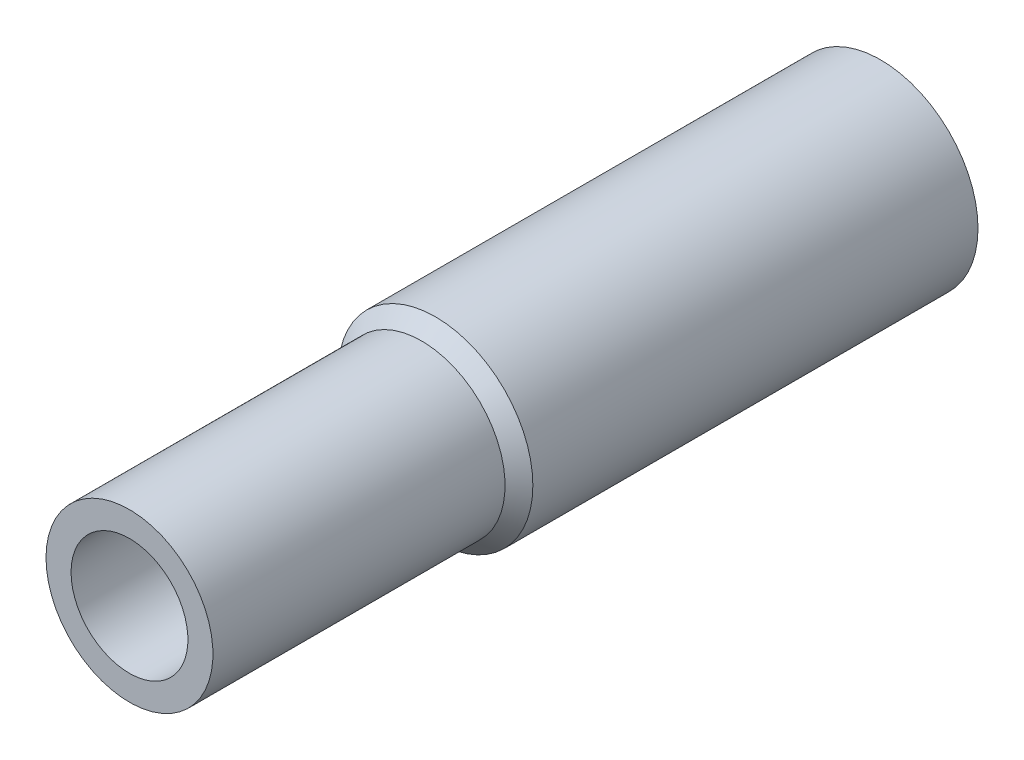
ISO-10303-21;
HEADER;
FILE_DESCRIPTION(('STEP AP214'),'2;1');
FILE_NAME('part.step','',(''),(''),'','','');
FILE_SCHEMA(('AUTOMOTIVE_DESIGN { 1 0 10303 214 1 1 1 1 }'));
ENDSEC;
DATA;
#1=APPLICATION_CONTEXT('core data for automotive mechanical design processes');
#2=APPLICATION_PROTOCOL_DEFINITION('international standard','automotive_design',2000,#1);
#3=PRODUCT_CONTEXT('',#1,'mechanical');
#4=PRODUCT('Part','Part','',(#3));
#5=PRODUCT_RELATED_PRODUCT_CATEGORY('part','',(#4));
#6=PRODUCT_DEFINITION_FORMATION('','',#4);
#7=PRODUCT_DEFINITION_CONTEXT('part definition',#1,'design');
#8=PRODUCT_DEFINITION('design','',#6,#7);
#9=PRODUCT_DEFINITION_SHAPE('','',#8);
#10=(LENGTH_UNIT() NAMED_UNIT(*) SI_UNIT(.MILLI.,.METRE.));
#11=(NAMED_UNIT(*) PLANE_ANGLE_UNIT() SI_UNIT($,.RADIAN.));
#12=(NAMED_UNIT(*) SI_UNIT($,.STERADIAN.) SOLID_ANGLE_UNIT());
#13=UNCERTAINTY_MEASURE_WITH_UNIT(LENGTH_MEASURE(1.E-05),#10,'distance_accuracy_value','');
#14=(GEOMETRIC_REPRESENTATION_CONTEXT(3) GLOBAL_UNCERTAINTY_ASSIGNED_CONTEXT((#13)) GLOBAL_UNIT_ASSIGNED_CONTEXT((#10,
#11,#12)) REPRESENTATION_CONTEXT('',''));
#15=CARTESIAN_POINT('',(0.,0.,0.));
#16=DIRECTION('',(0.,0.,1.));
#17=DIRECTION('',(1.,0.,0.));
#18=AXIS2_PLACEMENT_3D('',#15,#16,#17);
#19=CARTESIAN_POINT('',(0.,0.,16.5));
#20=DIRECTION('',(0.,0.,-1.));
#21=DIRECTION('',(-1.,0.,0.));
#22=AXIS2_PLACEMENT_3D('',#19,#20,#21);
#23=CYLINDRICAL_SURFACE('',#22,3.5);
#24=CARTESIAN_POINT('',(0.,0.,16.));
#25=DIRECTION('',(0.,0.,1.));
#26=DIRECTION('',(1.,0.,0.));
#27=AXIS2_PLACEMENT_3D('',#24,#25,#26);
#28=CIRCLE('',#27,3.5);
#29=CARTESIAN_POINT('',(3.5,0.,16.));
#30=VERTEX_POINT('',#29);
#31=EDGE_CURVE('E10',#30,#30,#28,.F.);
#32=ORIENTED_EDGE('',*,*,#31,.T.);
#33=EDGE_LOOP('',(#32));
#34=FACE_BOUND('',#33,.T.);
#35=CARTESIAN_POINT('',(0.,0.,0.));
#36=DIRECTION('',(0.,0.,1.));
#37=DIRECTION('',(1.,0.,0.));
#38=AXIS2_PLACEMENT_3D('',#35,#36,#37);
#39=CIRCLE('',#38,3.5);
#40=CARTESIAN_POINT('',(3.5,0.,0.));
#41=VERTEX_POINT('',#40);
#42=EDGE_CURVE('E53',#41,#41,#39,.T.);
#43=ORIENTED_EDGE('',*,*,#42,.T.);
#44=EDGE_LOOP('',(#43));
#45=FACE_BOUND('',#44,.T.);
#46=ADVANCED_FACE('F39',(#34,#45),#23,.T.);
#47=CARTESIAN_POINT('',(0.,0.,0.));
#48=DIRECTION('',(0.,0.,1.));
#49=DIRECTION('',(1.,0.,0.));
#50=AXIS2_PLACEMENT_3D('',#47,#48,#49);
#51=PLANE('',#50);
#52=CARTESIAN_POINT('',(0.,0.,0.));
#53=DIRECTION('',(0.,0.,-1.));
#54=DIRECTION('',(-1.,0.,0.));
#55=AXIS2_PLACEMENT_3D('',#52,#53,#54);
#56=CIRCLE('',#55,2.75);
#57=CARTESIAN_POINT('',(-2.75,0.,0.));
#58=VERTEX_POINT('',#57);
#59=EDGE_CURVE('E72',#58,#58,#56,.T.);
#60=ORIENTED_EDGE('',*,*,#59,.F.);
#61=EDGE_LOOP('',(#60));
#62=FACE_BOUND('',#61,.T.);
#63=ORIENTED_EDGE('',*,*,#42,.F.);
#64=EDGE_LOOP('',(#63));
#65=FACE_BOUND('',#64,.T.);
#66=ADVANCED_FACE('F79',(#62,#65),#51,.F.);
#67=CARTESIAN_POINT('',(0.,0.,16.5));
#68=DIRECTION('',(0.,0.,-1.));
#69=DIRECTION('',(-1.,0.,0.));
#70=AXIS2_PLACEMENT_3D('',#67,#68,#69);
#71=CONICAL_SURFACE('',#70,2.99999999999999,0.785398163397454);
#72=ORIENTED_EDGE('',*,*,#31,.F.);
#73=EDGE_LOOP('',(#72));
#74=FACE_BOUND('',#73,.T.);
#75=CARTESIAN_POINT('',(0.,0.,16.5));
#76=DIRECTION('',(0.,0.,1.));
#77=DIRECTION('',(1.,0.,0.));
#78=AXIS2_PLACEMENT_3D('',#75,#76,#77);
#79=CIRCLE('',#78,2.99999999999999);
#80=CARTESIAN_POINT('',(-3.,0.,16.5));
#81=VERTEX_POINT('',#80);
#82=EDGE_CURVE('E48',#81,#81,#79,.T.);
#83=ORIENTED_EDGE('',*,*,#82,.F.);
#84=EDGE_LOOP('',(#83));
#85=FACE_BOUND('',#84,.T.);
#86=ADVANCED_FACE('F42',(#74,#85),#71,.T.);
#87=CARTESIAN_POINT('',(0.,0.,27.));
#88=DIRECTION('',(0.,0.,-1.));
#89=DIRECTION('',(-1.,0.,0.));
#90=AXIS2_PLACEMENT_3D('',#87,#88,#89);
#91=CYLINDRICAL_SURFACE('',#90,3.);
#92=CARTESIAN_POINT('',(0.,0.,27.));
#93=DIRECTION('',(0.,0.,1.));
#94=DIRECTION('',(1.,0.,0.));
#95=AXIS2_PLACEMENT_3D('',#92,#93,#94);
#96=CIRCLE('',#95,3.);
#97=CARTESIAN_POINT('',(-3.,0.,27.));
#98=VERTEX_POINT('',#97);
#99=EDGE_CURVE('E58',#98,#98,#96,.T.);
#100=CARTESIAN_POINT('',(-3.,0.,27.));
#101=CARTESIAN_POINT('',(-3.,0.,26.890625));
#102=CARTESIAN_POINT('',(-3.,0.,26.78125));
#103=CARTESIAN_POINT('',(-3.,0.,26.5625));
#104=CARTESIAN_POINT('',(-3.,0.,26.453125));
#105=CARTESIAN_POINT('',(-3.,0.,26.234375));
#106=CARTESIAN_POINT('',(-3.,0.,26.125));
#107=CARTESIAN_POINT('',(-3.,0.,25.90625));
#108=CARTESIAN_POINT('',(-3.,0.,25.796875));
#109=CARTESIAN_POINT('',(-3.,0.,25.578125));
#110=CARTESIAN_POINT('',(-3.,0.,25.46875));
#111=CARTESIAN_POINT('',(-3.,0.,25.25));
#112=CARTESIAN_POINT('',(-3.,0.,25.140625));
#113=CARTESIAN_POINT('',(-3.,0.,24.921875));
#114=CARTESIAN_POINT('',(-3.,0.,24.8125));
#115=CARTESIAN_POINT('',(-3.,0.,24.59375));
#116=CARTESIAN_POINT('',(-3.,0.,24.484375));
#117=CARTESIAN_POINT('',(-3.,0.,24.265625));
#118=CARTESIAN_POINT('',(-3.,0.,24.15625));
#119=CARTESIAN_POINT('',(-3.,0.,23.9375));
#120=CARTESIAN_POINT('',(-3.,0.,23.828125));
#121=CARTESIAN_POINT('',(-3.,0.,23.609375));
#122=CARTESIAN_POINT('',(-3.,0.,23.5));
#123=CARTESIAN_POINT('',(-3.,0.,23.28125));
#124=CARTESIAN_POINT('',(-3.,0.,23.171875));
#125=CARTESIAN_POINT('',(-3.,0.,22.953125));
#126=CARTESIAN_POINT('',(-3.,0.,22.84375));
#127=CARTESIAN_POINT('',(-3.,0.,22.625));
#128=CARTESIAN_POINT('',(-3.,0.,22.515625));
#129=CARTESIAN_POINT('',(-3.,0.,22.296875));
#130=CARTESIAN_POINT('',(-3.,0.,22.1875));
#131=CARTESIAN_POINT('',(-3.,0.,21.96875));
#132=CARTESIAN_POINT('',(-3.,0.,21.859375));
#133=CARTESIAN_POINT('',(-3.,0.,21.640625));
#134=CARTESIAN_POINT('',(-3.,0.,21.53125));
#135=CARTESIAN_POINT('',(-3.,0.,21.3125));
#136=CARTESIAN_POINT('',(-3.,0.,21.203125));
#137=CARTESIAN_POINT('',(-3.,0.,20.984375));
#138=CARTESIAN_POINT('',(-3.,0.,20.875));
#139=CARTESIAN_POINT('',(-3.,0.,20.65625));
#140=CARTESIAN_POINT('',(-3.,0.,20.546875));
#141=CARTESIAN_POINT('',(-3.,0.,20.328125));
#142=CARTESIAN_POINT('',(-3.,0.,20.21875));
#143=CARTESIAN_POINT('',(-3.,0.,20.));
#144=CARTESIAN_POINT('',(-3.,0.,19.890625));
#145=CARTESIAN_POINT('',(-3.,0.,19.671875));
#146=CARTESIAN_POINT('',(-3.,0.,19.5625));
#147=CARTESIAN_POINT('',(-3.,0.,19.34375));
#148=CARTESIAN_POINT('',(-3.,0.,19.234375));
#149=CARTESIAN_POINT('',(-3.,0.,19.015625));
#150=CARTESIAN_POINT('',(-3.,0.,18.90625));
#151=CARTESIAN_POINT('',(-3.,0.,18.6875));
#152=CARTESIAN_POINT('',(-3.,0.,18.578125));
#153=CARTESIAN_POINT('',(-3.,0.,18.359375));
#154=CARTESIAN_POINT('',(-3.,0.,18.25));
#155=CARTESIAN_POINT('',(-3.,0.,18.03125));
#156=CARTESIAN_POINT('',(-3.,0.,17.921875));
#157=CARTESIAN_POINT('',(-3.,0.,17.703125));
#158=CARTESIAN_POINT('',(-3.,0.,17.59375));
#159=CARTESIAN_POINT('',(-3.,0.,17.375));
#160=CARTESIAN_POINT('',(-3.,0.,17.265625));
#161=CARTESIAN_POINT('',(-3.,0.,17.046875));
#162=CARTESIAN_POINT('',(-3.,0.,16.9375));
#163=CARTESIAN_POINT('',(-3.,0.,16.71875));
#164=CARTESIAN_POINT('',(-3.,0.,16.609375));
#165=CARTESIAN_POINT('',(-3.,0.,16.5));
#166=B_SPLINE_CURVE_WITH_KNOTS('',3,(#100,#101,#102,#103,#104,#105,#106,#107,#108,#109,#110,
#111,#112,#113,#114,#115,#116,#117,#118,#119,#120,#121,#122,#123,#124,#125,#126,#127,#128,#129,
#130,#131,#132,#133,#134,#135,#136,#137,#138,#139,#140,#141,#142,#143,#144,#145,#146,#147,#148,
#149,#150,#151,#152,#153,#154,#155,#156,#157,#158,#159,#160,#161,#162,#163,#164,#165),
.UNSPECIFIED.,.F.,.F.,(4,2,2,2,2,2,2,2,2,2,2,2,2,2,2,2,2,2,2,2,2,2,2,2,2,2,2,2,2,2,2,2,4),(0.,
0.328125000000002,0.656250000000001,0.984375000000003,1.3125,1.640625,1.96875,2.296875,2.625,
2.953125,3.28125,3.609375,3.9375,4.265625,4.59375,4.921875,5.25,5.578125,5.90625,6.234375,
6.5625,6.890625,7.21875,7.54687500000001,7.875,8.20312500000001,8.53125,8.859375,9.1875,
9.515625,9.84375000000001,10.171875,10.5),.UNSPECIFIED.);
#167=EDGE_CURVE('BSEAM89',#98,#81,#166,.T.);
#168=ORIENTED_EDGE('',*,*,#99,.F.);
#169=ORIENTED_EDGE('',*,*,#82,.T.);
#170=ORIENTED_EDGE('',*,*,#167,.T.);
#171=ORIENTED_EDGE('',*,*,#167,.F.);
#172=EDGE_LOOP('',(#168,#170,#169,#171));
#173=FACE_BOUND('',#172,.T.);
#174=ADVANCED_FACE('F89',(#173),#91,.T.);
#175=CARTESIAN_POINT('',(0.,0.,27.));
#176=DIRECTION('',(0.,0.,1.));
#177=DIRECTION('',(1.,0.,0.));
#178=AXIS2_PLACEMENT_3D('',#175,#176,#177);
#179=PLANE('',#178);
#180=CARTESIAN_POINT('',(0.,0.,27.));
#181=DIRECTION('',(0.,0.,-1.));
#182=DIRECTION('',(-1.,0.,0.));
#183=AXIS2_PLACEMENT_3D('',#180,#181,#182);
#184=CIRCLE('',#183,2.09999999999999);
#185=CARTESIAN_POINT('',(-2.09999999999999,0.,27.));
#186=VERTEX_POINT('',#185);
#187=EDGE_CURVE('E64',#186,#186,#184,.T.);
#188=ORIENTED_EDGE('',*,*,#187,.T.);
#189=EDGE_LOOP('',(#188));
#190=FACE_BOUND('',#189,.T.);
#191=ORIENTED_EDGE('',*,*,#99,.T.);
#192=EDGE_LOOP('',(#191));
#193=FACE_BOUND('',#192,.T.);
#194=ADVANCED_FACE('F92',(#190,#193),#179,.T.);
#195=CARTESIAN_POINT('',(0.,0.,0.));
#196=DIRECTION('',(0.,0.,-1.));
#197=DIRECTION('',(-1.,0.,0.));
#198=AXIS2_PLACEMENT_3D('',#195,#196,#197);
#199=CYLINDRICAL_SURFACE('',#198,2.1);
#200=ORIENTED_EDGE('',*,*,#187,.F.);
#201=EDGE_LOOP('',(#200));
#202=FACE_BOUND('',#201,.T.);
#203=CARTESIAN_POINT('',(0.,0.,0.649999999999998));
#204=DIRECTION('',(0.,0.,-1.));
#205=DIRECTION('',(-1.,0.,0.));
#206=AXIS2_PLACEMENT_3D('',#203,#204,#205);
#207=CIRCLE('',#206,2.1);
#208=CARTESIAN_POINT('',(-2.1,0.,0.649999999999998));
#209=VERTEX_POINT('',#208);
#210=EDGE_CURVE('E68',#209,#209,#207,.T.);
#211=ORIENTED_EDGE('',*,*,#210,.T.);
#212=EDGE_LOOP('',(#211));
#213=FACE_BOUND('',#212,.T.);
#214=ADVANCED_FACE('F96',(#202,#213),#199,.F.);
#215=CARTESIAN_POINT('',(0.,0.,0.));
#216=DIRECTION('',(0.,0.,-1.));
#217=DIRECTION('',(-1.,0.,0.));
#218=AXIS2_PLACEMENT_3D('',#215,#216,#217);
#219=CONICAL_SURFACE('',#218,2.75,0.785398163397452);
#220=ORIENTED_EDGE('',*,*,#210,.F.);
#221=EDGE_LOOP('',(#220));
#222=FACE_BOUND('',#221,.T.);
#223=ORIENTED_EDGE('',*,*,#59,.T.);
#224=EDGE_LOOP('',(#223));
#225=FACE_BOUND('',#224,.T.);
#226=ADVANCED_FACE('F77',(#222,#225),#219,.F.);
#227=CLOSED_SHELL('',(#46,#66,#86,#174,#194,#214,#226));
#228=MANIFOLD_SOLID_BREP('B2',#227);
#229=ADVANCED_BREP_SHAPE_REPRESENTATION('',(#18,#228),#14);
#230=SHAPE_DEFINITION_REPRESENTATION(#9,#229);
ENDSEC;
END-ISO-10303-21;
